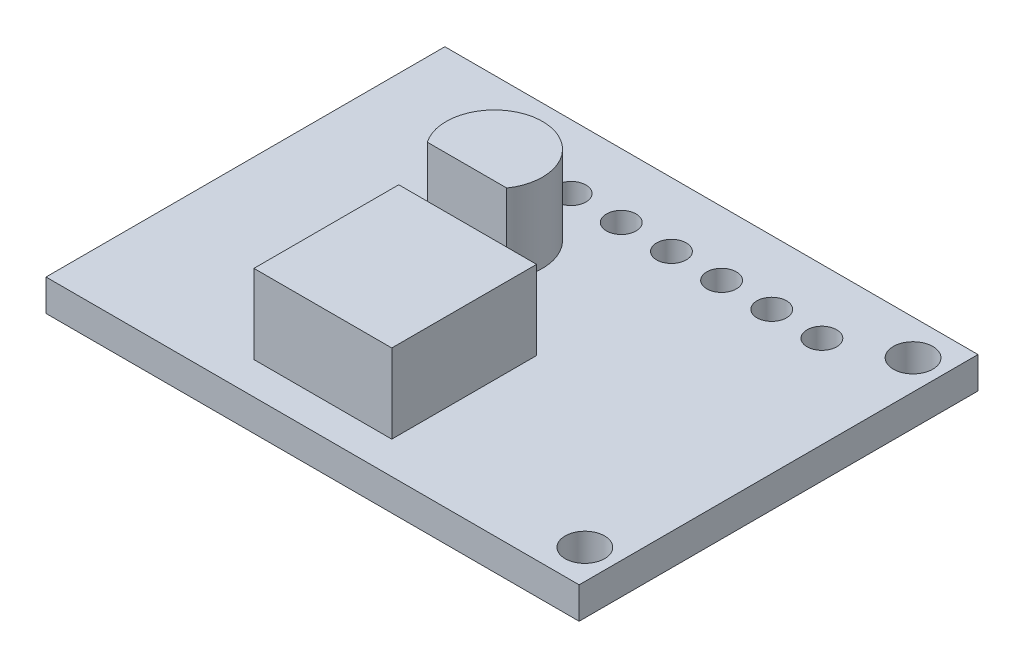
ISO-10303-21;
HEADER;
FILE_DESCRIPTION(('STEP AP214'),'2;1');
FILE_NAME('part.step','',(''),(''),'','','');
FILE_SCHEMA(('AUTOMOTIVE_DESIGN { 1 0 10303 214 1 1 1 1 }'));
ENDSEC;
DATA;
#1=APPLICATION_CONTEXT('core data for automotive mechanical design processes');
#2=APPLICATION_PROTOCOL_DEFINITION('international standard','automotive_design',2000,#1);
#3=PRODUCT_CONTEXT('',#1,'mechanical');
#4=PRODUCT('Part','Part','',(#3));
#5=PRODUCT_RELATED_PRODUCT_CATEGORY('part','',(#4));
#6=PRODUCT_DEFINITION_FORMATION('','',#4);
#7=PRODUCT_DEFINITION_CONTEXT('part definition',#1,'design');
#8=PRODUCT_DEFINITION('design','',#6,#7);
#9=PRODUCT_DEFINITION_SHAPE('','',#8);
#10=(LENGTH_UNIT() NAMED_UNIT(*) SI_UNIT(.MILLI.,.METRE.));
#11=(NAMED_UNIT(*) PLANE_ANGLE_UNIT() SI_UNIT($,.RADIAN.));
#12=(NAMED_UNIT(*) SI_UNIT($,.STERADIAN.) SOLID_ANGLE_UNIT());
#13=UNCERTAINTY_MEASURE_WITH_UNIT(LENGTH_MEASURE(1.E-05),#10,'distance_accuracy_value','');
#14=(GEOMETRIC_REPRESENTATION_CONTEXT(3) GLOBAL_UNCERTAINTY_ASSIGNED_CONTEXT((#13)) GLOBAL_UNIT_ASSIGNED_CONTEXT((#10,
#11,#12)) REPRESENTATION_CONTEXT('',''));
#15=CARTESIAN_POINT('',(0.,0.,0.));
#16=DIRECTION('',(0.,0.,1.));
#17=DIRECTION('',(1.,0.,0.));
#18=AXIS2_PLACEMENT_3D('',#15,#16,#17);
#19=CARTESIAN_POINT('',(0.,1.6,0.));
#20=DIRECTION('',(0.,-1.,0.));
#21=DIRECTION('',(0.,0.,-1.));
#22=AXIS2_PLACEMENT_3D('',#19,#20,#21);
#23=PLANE('',#22);
#24=DIRECTION('',(0.,0.,1.));
#25=VECTOR('',#24,1.);
#26=CARTESIAN_POINT('',(-4.6136955107352,1.6,1.12298160525226));
#27=LINE('',#26,#25);
#28=CARTESIAN_POINT('',(-4.6136955107352,1.6,1.12298160525226));
#29=VERTEX_POINT('',#28);
#30=CARTESIAN_POINT('',(-4.6136955107352,1.6,8.45618678653812));
#31=VERTEX_POINT('',#30);
#32=EDGE_CURVE('E126',#29,#31,#27,.T.);
#33=ORIENTED_EDGE('',*,*,#32,.F.);
#34=DIRECTION('',(-1.,0.,0.));
#35=VECTOR('',#34,1.);
#36=CARTESIAN_POINT('',(-4.6136955107352,1.6,1.12298160525226));
#37=LINE('',#36,#35);
#38=CARTESIAN_POINT('',(2.36773230023067,1.6,1.12298160525226));
#39=VERTEX_POINT('',#38);
#40=EDGE_CURVE('E137',#39,#29,#37,.T.);
#41=ORIENTED_EDGE('',*,*,#40,.F.);
#42=DIRECTION('',(0.,0.,-1.));
#43=VECTOR('',#42,1.);
#44=CARTESIAN_POINT('',(2.36773230023067,1.6,1.12298160525226));
#45=LINE('',#44,#43);
#46=CARTESIAN_POINT('',(2.36773230023067,1.6,8.45618678653812));
#47=VERTEX_POINT('',#46);
#48=EDGE_CURVE('E145',#47,#39,#45,.T.);
#49=ORIENTED_EDGE('',*,*,#48,.F.);
#50=DIRECTION('',(1.,0.,0.));
#51=VECTOR('',#50,1.);
#52=CARTESIAN_POINT('',(-4.6136955107352,1.6,8.45618678653812));
#53=LINE('',#52,#51);
#54=EDGE_CURVE('E55',#31,#47,#53,.T.);
#55=ORIENTED_EDGE('',*,*,#54,.F.);
#56=EDGE_LOOP('',(#33,#41,#49,#55));
#57=FACE_BOUND('',#56,.T.);
#58=CARTESIAN_POINT('',(-3.86497604542497,1.6,-6.85965872123964));
#59=DIRECTION('',(0.,1.,0.));
#60=DIRECTION('',(0.,0.,1.));
#61=AXIS2_PLACEMENT_3D('',#58,#59,#60);
#62=CIRCLE('',#61,0.749999999999999);
#63=CARTESIAN_POINT('',(-3.86497604542497,1.6,-6.10965872123964));
#64=VERTEX_POINT('',#63);
#65=EDGE_CURVE('E160',#64,#64,#62,.T.);
#66=ORIENTED_EDGE('',*,*,#65,.F.);
#67=EDGE_LOOP('',(#66));
#68=FACE_BOUND('',#67,.T.);
#69=CARTESIAN_POINT('',(-1.32497604542497,1.6,-6.85965872123966));
#70=DIRECTION('',(0.,1.,0.));
#71=DIRECTION('',(0.,0.,1.));
#72=AXIS2_PLACEMENT_3D('',#69,#70,#71);
#73=CIRCLE('',#72,0.749999999999999);
#74=CARTESIAN_POINT('',(-1.32497604542497,1.6,-6.10965872123966));
#75=VERTEX_POINT('',#74);
#76=EDGE_CURVE('E164',#75,#75,#73,.T.);
#77=ORIENTED_EDGE('',*,*,#76,.F.);
#78=EDGE_LOOP('',(#77));
#79=FACE_BOUND('',#78,.T.);
#80=CARTESIAN_POINT('',(1.21502395457503,1.6,-6.85965872123967));
#81=DIRECTION('',(0.,1.,0.));
#82=DIRECTION('',(0.,0.,1.));
#83=AXIS2_PLACEMENT_3D('',#80,#81,#82);
#84=CIRCLE('',#83,0.749999999999999);
#85=CARTESIAN_POINT('',(1.21502395457503,1.6,-6.10965872123968));
#86=VERTEX_POINT('',#85);
#87=EDGE_CURVE('E170',#86,#86,#84,.T.);
#88=ORIENTED_EDGE('',*,*,#87,.F.);
#89=EDGE_LOOP('',(#88));
#90=FACE_BOUND('',#89,.T.);
#91=CARTESIAN_POINT('',(3.75502395457503,1.6,-6.85965872123969));
#92=DIRECTION('',(0.,1.,0.));
#93=DIRECTION('',(0.,0.,1.));
#94=AXIS2_PLACEMENT_3D('',#91,#92,#93);
#95=CIRCLE('',#94,0.749999999999999);
#96=CARTESIAN_POINT('',(3.75502395457503,1.6,-6.10965872123969));
#97=VERTEX_POINT('',#96);
#98=EDGE_CURVE('E176',#97,#97,#95,.T.);
#99=ORIENTED_EDGE('',*,*,#98,.F.);
#100=EDGE_LOOP('',(#99));
#101=FACE_BOUND('',#100,.T.);
#102=CARTESIAN_POINT('',(6.29502395457503,1.6,-6.85965872123971));
#103=DIRECTION('',(0.,1.,0.));
#104=DIRECTION('',(0.,0.,1.));
#105=AXIS2_PLACEMENT_3D('',#102,#103,#104);
#106=CIRCLE('',#105,0.749999999999998);
#107=CARTESIAN_POINT('',(6.29502395457503,1.6,-6.10965872123971));
#108=VERTEX_POINT('',#107);
#109=EDGE_CURVE('E182',#108,#108,#106,.T.);
#110=ORIENTED_EDGE('',*,*,#109,.F.);
#111=EDGE_LOOP('',(#110));
#112=FACE_BOUND('',#111,.T.);
#113=CARTESIAN_POINT('',(8.83502395457503,1.6,-6.85965872123973));
#114=DIRECTION('',(0.,1.,0.));
#115=DIRECTION('',(0.,0.,1.));
#116=AXIS2_PLACEMENT_3D('',#113,#114,#115);
#117=CIRCLE('',#116,0.749999999999998);
#118=CARTESIAN_POINT('',(8.83502395457503,1.6,-6.10965872123973));
#119=VERTEX_POINT('',#118);
#120=EDGE_CURVE('E188',#119,#119,#117,.T.);
#121=ORIENTED_EDGE('',*,*,#120,.F.);
#122=EDGE_LOOP('',(#121));
#123=FACE_BOUND('',#122,.T.);
#124=CARTESIAN_POINT('',(12.,1.6,8.31054144281819));
#125=DIRECTION('',(0.,1.,0.));
#126=DIRECTION('',(0.,0.,1.));
#127=AXIS2_PLACEMENT_3D('',#124,#125,#126);
#128=CIRCLE('',#127,1.);
#129=CARTESIAN_POINT('',(12.,1.6,9.31054144281819));
#130=VERTEX_POINT('',#129);
#131=EDGE_CURVE('E194',#130,#130,#128,.T.);
#132=ORIENTED_EDGE('',*,*,#131,.F.);
#133=EDGE_LOOP('',(#132));
#134=FACE_BOUND('',#133,.T.);
#135=CARTESIAN_POINT('',(12.,1.6,-8.31054144281819));
#136=DIRECTION('',(0.,1.,0.));
#137=DIRECTION('',(0.,0.,1.));
#138=AXIS2_PLACEMENT_3D('',#135,#136,#137);
#139=CIRCLE('',#138,1.);
#140=CARTESIAN_POINT('',(12.,1.6,-7.31054144281819));
#141=VERTEX_POINT('',#140);
#142=EDGE_CURVE('E200',#141,#141,#139,.T.);
#143=ORIENTED_EDGE('',*,*,#142,.F.);
#144=EDGE_LOOP('',(#143));
#145=FACE_BOUND('',#144,.T.);
#146=DIRECTION('',(0.,0.,-1.));
#147=VECTOR('',#146,1.);
#148=CARTESIAN_POINT('',(13.5,1.6,10.1));
#149=LINE('',#148,#147);
#150=CARTESIAN_POINT('',(13.5,1.6,10.1));
#151=VERTEX_POINT('',#150);
#152=CARTESIAN_POINT('',(13.5,1.6,-10.1));
#153=VERTEX_POINT('',#152);
#154=EDGE_CURVE('E209',#151,#153,#149,.T.);
#155=ORIENTED_EDGE('',*,*,#154,.T.);
#156=DIRECTION('',(-1.,0.,0.));
#157=VECTOR('',#156,1.);
#158=CARTESIAN_POINT('',(-13.5,1.6,-10.1));
#159=LINE('',#158,#157);
#160=CARTESIAN_POINT('',(-13.5,1.6,-10.1));
#161=VERTEX_POINT('',#160);
#162=EDGE_CURVE('E212',#153,#161,#159,.T.);
#163=ORIENTED_EDGE('',*,*,#162,.T.);
#164=DIRECTION('',(0.,0.,1.));
#165=VECTOR('',#164,1.);
#166=CARTESIAN_POINT('',(-13.5,1.6,10.1));
#167=LINE('',#166,#165);
#168=CARTESIAN_POINT('',(-13.5,1.6,10.1));
#169=VERTEX_POINT('',#168);
#170=EDGE_CURVE('E215',#161,#169,#167,.T.);
#171=ORIENTED_EDGE('',*,*,#170,.T.);
#172=DIRECTION('',(1.,0.,0.));
#173=VECTOR('',#172,1.);
#174=CARTESIAN_POINT('',(-13.5,1.6,10.1));
#175=LINE('',#174,#173);
#176=EDGE_CURVE('E217',#169,#151,#175,.T.);
#177=ORIENTED_EDGE('',*,*,#176,.T.);
#178=EDGE_LOOP('',(#155,#163,#171,#177));
#179=FACE_BOUND('',#178,.T.);
#180=CARTESIAN_POINT('',(-3.74778198379369,1.6,-2.85480865913526));
#181=DIRECTION('',(0.,1.,0.));
#182=DIRECTION('',(0.,0.,1.));
#183=AXIS2_PLACEMENT_3D('',#180,#181,#182);
#184=CIRCLE('',#183,2.44213737419818);
#185=CARTESIAN_POINT('',(-1.73694544412219,1.6,-1.46896185476707));
#186=VERTEX_POINT('',#185);
#187=CARTESIAN_POINT('',(-5.7586185234652,1.6,-1.46896185476707));
#188=VERTEX_POINT('',#187);
#189=EDGE_CURVE('E125',#186,#188,#184,.T.);
#190=ORIENTED_EDGE('',*,*,#189,.F.);
#191=DIRECTION('',(1.,0.,0.));
#192=VECTOR('',#191,1.);
#193=CARTESIAN_POINT('',(-5.7586185234652,1.6,-1.46896185476707));
#194=LINE('',#193,#192);
#195=EDGE_CURVE('E47',#188,#186,#194,.T.);
#196=ORIENTED_EDGE('',*,*,#195,.F.);
#197=EDGE_LOOP('',(#190,#196));
#198=FACE_BOUND('',#197,.T.);
#199=ADVANCED_FACE('F33',(#57,#68,#79,#90,#101,#112,#123,#134,#145,#179,#198),#23,.F.);
#200=CARTESIAN_POINT('',(13.5,1.6,10.1));
#201=DIRECTION('',(-1.,0.,0.));
#202=DIRECTION('',(0.,0.,1.));
#203=AXIS2_PLACEMENT_3D('',#200,#201,#202);
#204=PLANE('',#203);
#205=DIRECTION('',(0.,0.,-1.));
#206=VECTOR('',#205,1.);
#207=CARTESIAN_POINT('',(13.5,0.,10.1));
#208=LINE('',#207,#206);
#209=CARTESIAN_POINT('',(13.5,0.,10.1));
#210=VERTEX_POINT('',#209);
#211=CARTESIAN_POINT('',(13.5,0.,-10.1));
#212=VERTEX_POINT('',#211);
#213=EDGE_CURVE('E206',#210,#212,#208,.T.);
#214=ORIENTED_EDGE('',*,*,#213,.T.);
#215=DIRECTION('',(0.,-1.,0.));
#216=VECTOR('',#215,1.);
#217=CARTESIAN_POINT('',(13.5,1.6,-10.1));
#218=LINE('',#217,#216);
#219=EDGE_CURVE('E11',#153,#212,#218,.T.);
#220=ORIENTED_EDGE('',*,*,#219,.F.);
#221=ORIENTED_EDGE('',*,*,#154,.F.);
#222=DIRECTION('',(0.,-1.,0.));
#223=VECTOR('',#222,1.);
#224=CARTESIAN_POINT('',(13.5,1.6,10.1));
#225=LINE('',#224,#223);
#226=EDGE_CURVE('E219',#151,#210,#225,.T.);
#227=ORIENTED_EDGE('',*,*,#226,.T.);
#228=EDGE_LOOP('',(#214,#220,#221,#227));
#229=FACE_BOUND('',#228,.T.);
#230=ADVANCED_FACE('F35',(#229),#204,.F.);
#231=CARTESIAN_POINT('',(-13.5,1.6,-10.1));
#232=DIRECTION('',(0.,0.,1.));
#233=DIRECTION('',(1.,0.,0.));
#234=AXIS2_PLACEMENT_3D('',#231,#232,#233);
#235=PLANE('',#234);
#236=DIRECTION('',(-1.,0.,0.));
#237=VECTOR('',#236,1.);
#238=CARTESIAN_POINT('',(-13.5,0.,-10.1));
#239=LINE('',#238,#237);
#240=CARTESIAN_POINT('',(-13.5,0.,-10.1));
#241=VERTEX_POINT('',#240);
#242=EDGE_CURVE('E222',#212,#241,#239,.T.);
#243=ORIENTED_EDGE('',*,*,#242,.T.);
#244=DIRECTION('',(0.,-1.,0.));
#245=VECTOR('',#244,1.);
#246=CARTESIAN_POINT('',(-13.5,1.6,-10.1));
#247=LINE('',#246,#245);
#248=EDGE_CURVE('E41',#161,#241,#247,.T.);
#249=ORIENTED_EDGE('',*,*,#248,.F.);
#250=ORIENTED_EDGE('',*,*,#162,.F.);
#251=ORIENTED_EDGE('',*,*,#219,.T.);
#252=EDGE_LOOP('',(#243,#249,#250,#251));
#253=FACE_BOUND('',#252,.T.);
#254=ADVANCED_FACE('F251',(#253),#235,.F.);
#255=CARTESIAN_POINT('',(-13.5,1.6,10.1));
#256=DIRECTION('',(1.,0.,0.));
#257=DIRECTION('',(0.,0.,-1.));
#258=AXIS2_PLACEMENT_3D('',#255,#256,#257);
#259=PLANE('',#258);
#260=DIRECTION('',(0.,0.,1.));
#261=VECTOR('',#260,1.);
#262=CARTESIAN_POINT('',(-13.5,0.,10.1));
#263=LINE('',#262,#261);
#264=CARTESIAN_POINT('',(-13.5,0.,10.1));
#265=VERTEX_POINT('',#264);
#266=EDGE_CURVE('E224',#241,#265,#263,.T.);
#267=ORIENTED_EDGE('',*,*,#266,.T.);
#268=DIRECTION('',(0.,-1.,0.));
#269=VECTOR('',#268,1.);
#270=CARTESIAN_POINT('',(-13.5,1.6,10.1));
#271=LINE('',#270,#269);
#272=EDGE_CURVE('E229',#169,#265,#271,.T.);
#273=ORIENTED_EDGE('',*,*,#272,.F.);
#274=ORIENTED_EDGE('',*,*,#170,.F.);
#275=ORIENTED_EDGE('',*,*,#248,.T.);
#276=EDGE_LOOP('',(#267,#273,#274,#275));
#277=FACE_BOUND('',#276,.T.);
#278=ADVANCED_FACE('F236',(#277),#259,.F.);
#279=CARTESIAN_POINT('',(-13.5,1.6,10.1));
#280=DIRECTION('',(0.,0.,-1.));
#281=DIRECTION('',(-1.,0.,0.));
#282=AXIS2_PLACEMENT_3D('',#279,#280,#281);
#283=PLANE('',#282);
#284=DIRECTION('',(1.,0.,0.));
#285=VECTOR('',#284,1.);
#286=CARTESIAN_POINT('',(-13.5,0.,10.1));
#287=LINE('',#286,#285);
#288=EDGE_CURVE('E213',#265,#210,#287,.T.);
#289=ORIENTED_EDGE('',*,*,#288,.T.);
#290=ORIENTED_EDGE('',*,*,#226,.F.);
#291=ORIENTED_EDGE('',*,*,#176,.F.);
#292=ORIENTED_EDGE('',*,*,#272,.T.);
#293=EDGE_LOOP('',(#289,#290,#291,#292));
#294=FACE_BOUND('',#293,.T.);
#295=ADVANCED_FACE('F245',(#294),#283,.F.);
#296=CARTESIAN_POINT('',(0.,0.,0.));
#297=DIRECTION('',(0.,-1.,0.));
#298=DIRECTION('',(0.,0.,-1.));
#299=AXIS2_PLACEMENT_3D('',#296,#297,#298);
#300=PLANE('',#299);
#301=CARTESIAN_POINT('',(-3.86497604542497,0.,-6.85965872123964));
#302=DIRECTION('',(0.,1.,0.));
#303=DIRECTION('',(0.,0.,1.));
#304=AXIS2_PLACEMENT_3D('',#301,#302,#303);
#305=CIRCLE('',#304,0.749999999999999);
#306=CARTESIAN_POINT('',(-3.86497604542497,0.,-6.10965872123964));
#307=VERTEX_POINT('',#306);
#308=EDGE_CURVE('E161',#307,#307,#305,.T.);
#309=ORIENTED_EDGE('',*,*,#308,.T.);
#310=EDGE_LOOP('',(#309));
#311=FACE_BOUND('',#310,.T.);
#312=CARTESIAN_POINT('',(-1.32497604542497,0.,-6.85965872123966));
#313=DIRECTION('',(0.,1.,0.));
#314=DIRECTION('',(0.,0.,1.));
#315=AXIS2_PLACEMENT_3D('',#312,#313,#314);
#316=CIRCLE('',#315,0.749999999999999);
#317=CARTESIAN_POINT('',(-1.32497604542497,0.,-6.10965872123966));
#318=VERTEX_POINT('',#317);
#319=EDGE_CURVE('E167',#318,#318,#316,.T.);
#320=ORIENTED_EDGE('',*,*,#319,.T.);
#321=EDGE_LOOP('',(#320));
#322=FACE_BOUND('',#321,.T.);
#323=CARTESIAN_POINT('',(1.21502395457503,0.,-6.85965872123967));
#324=DIRECTION('',(0.,1.,0.));
#325=DIRECTION('',(0.,0.,1.));
#326=AXIS2_PLACEMENT_3D('',#323,#324,#325);
#327=CIRCLE('',#326,0.749999999999999);
#328=CARTESIAN_POINT('',(1.21502395457503,0.,-6.10965872123968));
#329=VERTEX_POINT('',#328);
#330=EDGE_CURVE('E173',#329,#329,#327,.T.);
#331=ORIENTED_EDGE('',*,*,#330,.T.);
#332=EDGE_LOOP('',(#331));
#333=FACE_BOUND('',#332,.T.);
#334=CARTESIAN_POINT('',(3.75502395457503,0.,-6.85965872123969));
#335=DIRECTION('',(0.,1.,0.));
#336=DIRECTION('',(0.,0.,1.));
#337=AXIS2_PLACEMENT_3D('',#334,#335,#336);
#338=CIRCLE('',#337,0.749999999999999);
#339=CARTESIAN_POINT('',(3.75502395457503,0.,-6.10965872123969));
#340=VERTEX_POINT('',#339);
#341=EDGE_CURVE('E179',#340,#340,#338,.T.);
#342=ORIENTED_EDGE('',*,*,#341,.T.);
#343=EDGE_LOOP('',(#342));
#344=FACE_BOUND('',#343,.T.);
#345=CARTESIAN_POINT('',(6.29502395457503,0.,-6.85965872123971));
#346=DIRECTION('',(0.,1.,0.));
#347=DIRECTION('',(0.,0.,1.));
#348=AXIS2_PLACEMENT_3D('',#345,#346,#347);
#349=CIRCLE('',#348,0.749999999999998);
#350=CARTESIAN_POINT('',(6.29502395457503,0.,-6.10965872123971));
#351=VERTEX_POINT('',#350);
#352=EDGE_CURVE('E185',#351,#351,#349,.T.);
#353=ORIENTED_EDGE('',*,*,#352,.T.);
#354=EDGE_LOOP('',(#353));
#355=FACE_BOUND('',#354,.T.);
#356=CARTESIAN_POINT('',(8.83502395457503,0.,-6.85965872123973));
#357=DIRECTION('',(0.,1.,0.));
#358=DIRECTION('',(0.,0.,1.));
#359=AXIS2_PLACEMENT_3D('',#356,#357,#358);
#360=CIRCLE('',#359,0.749999999999998);
#361=CARTESIAN_POINT('',(8.83502395457503,0.,-6.10965872123973));
#362=VERTEX_POINT('',#361);
#363=EDGE_CURVE('E191',#362,#362,#360,.T.);
#364=ORIENTED_EDGE('',*,*,#363,.T.);
#365=EDGE_LOOP('',(#364));
#366=FACE_BOUND('',#365,.T.);
#367=CARTESIAN_POINT('',(12.,0.,8.31054144281819));
#368=DIRECTION('',(0.,1.,0.));
#369=DIRECTION('',(0.,0.,1.));
#370=AXIS2_PLACEMENT_3D('',#367,#368,#369);
#371=CIRCLE('',#370,1.);
#372=CARTESIAN_POINT('',(12.,0.,9.31054144281819));
#373=VERTEX_POINT('',#372);
#374=EDGE_CURVE('E197',#373,#373,#371,.T.);
#375=ORIENTED_EDGE('',*,*,#374,.T.);
#376=EDGE_LOOP('',(#375));
#377=FACE_BOUND('',#376,.T.);
#378=CARTESIAN_POINT('',(12.,0.,-8.31054144281819));
#379=DIRECTION('',(0.,1.,0.));
#380=DIRECTION('',(0.,0.,1.));
#381=AXIS2_PLACEMENT_3D('',#378,#379,#380);
#382=CIRCLE('',#381,1.);
#383=CARTESIAN_POINT('',(12.,0.,-7.31054144281819));
#384=VERTEX_POINT('',#383);
#385=EDGE_CURVE('E203',#384,#384,#382,.T.);
#386=ORIENTED_EDGE('',*,*,#385,.T.);
#387=EDGE_LOOP('',(#386));
#388=FACE_BOUND('',#387,.T.);
#389=ORIENTED_EDGE('',*,*,#213,.F.);
#390=ORIENTED_EDGE('',*,*,#288,.F.);
#391=ORIENTED_EDGE('',*,*,#266,.F.);
#392=ORIENTED_EDGE('',*,*,#242,.F.);
#393=EDGE_LOOP('',(#389,#390,#391,#392));
#394=FACE_BOUND('',#393,.T.);
#395=ADVANCED_FACE('F242',(#311,#322,#333,#344,#355,#366,#377,#388,#394),#300,.T.);
#396=CARTESIAN_POINT('',(12.,0.,-8.31054144281819));
#397=DIRECTION('',(0.,1.,0.));
#398=DIRECTION('',(0.,0.,1.));
#399=AXIS2_PLACEMENT_3D('',#396,#397,#398);
#400=CYLINDRICAL_SURFACE('',#399,1.);
#401=ORIENTED_EDGE('',*,*,#385,.F.);
#402=EDGE_LOOP('',(#401));
#403=FACE_BOUND('',#402,.T.);
#404=ORIENTED_EDGE('',*,*,#142,.T.);
#405=EDGE_LOOP('',(#404));
#406=FACE_BOUND('',#405,.T.);
#407=ADVANCED_FACE('F267',(#403,#406),#400,.F.);
#408=CARTESIAN_POINT('',(12.,0.,8.31054144281819));
#409=DIRECTION('',(0.,1.,0.));
#410=DIRECTION('',(0.,0.,1.));
#411=AXIS2_PLACEMENT_3D('',#408,#409,#410);
#412=CYLINDRICAL_SURFACE('',#411,1.);
#413=ORIENTED_EDGE('',*,*,#374,.F.);
#414=EDGE_LOOP('',(#413));
#415=FACE_BOUND('',#414,.T.);
#416=ORIENTED_EDGE('',*,*,#131,.T.);
#417=EDGE_LOOP('',(#416));
#418=FACE_BOUND('',#417,.T.);
#419=ADVANCED_FACE('F292',(#415,#418),#412,.F.);
#420=CARTESIAN_POINT('',(8.83502395457503,0.,-6.85965872123973));
#421=DIRECTION('',(0.,1.,0.));
#422=DIRECTION('',(0.,0.,1.));
#423=AXIS2_PLACEMENT_3D('',#420,#421,#422);
#424=CYLINDRICAL_SURFACE('',#423,0.749999999999998);
#425=ORIENTED_EDGE('',*,*,#363,.F.);
#426=EDGE_LOOP('',(#425));
#427=FACE_BOUND('',#426,.T.);
#428=ORIENTED_EDGE('',*,*,#120,.T.);
#429=EDGE_LOOP('',(#428));
#430=FACE_BOUND('',#429,.T.);
#431=ADVANCED_FACE('F296',(#427,#430),#424,.F.);
#432=CARTESIAN_POINT('',(6.29502395457503,0.,-6.85965872123971));
#433=DIRECTION('',(0.,1.,0.));
#434=DIRECTION('',(0.,0.,1.));
#435=AXIS2_PLACEMENT_3D('',#432,#433,#434);
#436=CYLINDRICAL_SURFACE('',#435,0.749999999999998);
#437=ORIENTED_EDGE('',*,*,#352,.F.);
#438=EDGE_LOOP('',(#437));
#439=FACE_BOUND('',#438,.T.);
#440=ORIENTED_EDGE('',*,*,#109,.T.);
#441=EDGE_LOOP('',(#440));
#442=FACE_BOUND('',#441,.T.);
#443=ADVANCED_FACE('F309',(#439,#442),#436,.F.);
#444=CARTESIAN_POINT('',(3.75502395457503,0.,-6.85965872123969));
#445=DIRECTION('',(0.,1.,0.));
#446=DIRECTION('',(0.,0.,1.));
#447=AXIS2_PLACEMENT_3D('',#444,#445,#446);
#448=CYLINDRICAL_SURFACE('',#447,0.749999999999999);
#449=ORIENTED_EDGE('',*,*,#341,.F.);
#450=EDGE_LOOP('',(#449));
#451=FACE_BOUND('',#450,.T.);
#452=ORIENTED_EDGE('',*,*,#98,.T.);
#453=EDGE_LOOP('',(#452));
#454=FACE_BOUND('',#453,.T.);
#455=ADVANCED_FACE('F317',(#451,#454),#448,.F.);
#456=CARTESIAN_POINT('',(1.21502395457503,0.,-6.85965872123967));
#457=DIRECTION('',(0.,1.,0.));
#458=DIRECTION('',(0.,0.,1.));
#459=AXIS2_PLACEMENT_3D('',#456,#457,#458);
#460=CYLINDRICAL_SURFACE('',#459,0.749999999999999);
#461=ORIENTED_EDGE('',*,*,#330,.F.);
#462=EDGE_LOOP('',(#461));
#463=FACE_BOUND('',#462,.T.);
#464=ORIENTED_EDGE('',*,*,#87,.T.);
#465=EDGE_LOOP('',(#464));
#466=FACE_BOUND('',#465,.T.);
#467=ADVANCED_FACE('F325',(#463,#466),#460,.F.);
#468=CARTESIAN_POINT('',(-1.32497604542497,0.,-6.85965872123966));
#469=DIRECTION('',(0.,1.,0.));
#470=DIRECTION('',(0.,0.,1.));
#471=AXIS2_PLACEMENT_3D('',#468,#469,#470);
#472=CYLINDRICAL_SURFACE('',#471,0.749999999999999);
#473=ORIENTED_EDGE('',*,*,#319,.F.);
#474=EDGE_LOOP('',(#473));
#475=FACE_BOUND('',#474,.T.);
#476=ORIENTED_EDGE('',*,*,#76,.T.);
#477=EDGE_LOOP('',(#476));
#478=FACE_BOUND('',#477,.T.);
#479=ADVANCED_FACE('F333',(#475,#478),#472,.F.);
#480=CARTESIAN_POINT('',(-3.86497604542497,0.,-6.85965872123964));
#481=DIRECTION('',(0.,1.,0.));
#482=DIRECTION('',(0.,0.,1.));
#483=AXIS2_PLACEMENT_3D('',#480,#481,#482);
#484=CYLINDRICAL_SURFACE('',#483,0.749999999999999);
#485=ORIENTED_EDGE('',*,*,#308,.F.);
#486=EDGE_LOOP('',(#485));
#487=FACE_BOUND('',#486,.T.);
#488=ORIENTED_EDGE('',*,*,#65,.T.);
#489=EDGE_LOOP('',(#488));
#490=FACE_BOUND('',#489,.T.);
#491=ADVANCED_FACE('F341',(#487,#490),#484,.F.);
#492=CARTESIAN_POINT('',(-4.6136955107352,5.6,1.12298160525226));
#493=DIRECTION('',(1.,0.,0.));
#494=DIRECTION('',(0.,0.,-1.));
#495=AXIS2_PLACEMENT_3D('',#492,#493,#494);
#496=PLANE('',#495);
#497=ORIENTED_EDGE('',*,*,#32,.T.);
#498=DIRECTION('',(0.,-1.,0.));
#499=VECTOR('',#498,1.);
#500=CARTESIAN_POINT('',(-4.6136955107352,5.6,8.45618678653812));
#501=LINE('',#500,#499);
#502=CARTESIAN_POINT('',(-4.6136955107352,5.6,8.45618678653812));
#503=VERTEX_POINT('',#502);
#504=EDGE_CURVE('E158',#503,#31,#501,.T.);
#505=ORIENTED_EDGE('',*,*,#504,.F.);
#506=DIRECTION('',(0.,0.,1.));
#507=VECTOR('',#506,1.);
#508=CARTESIAN_POINT('',(-4.6136955107352,5.6,1.12298160525226));
#509=LINE('',#508,#507);
#510=CARTESIAN_POINT('',(-4.6136955107352,5.6,1.12298160525226));
#511=VERTEX_POINT('',#510);
#512=EDGE_CURVE('E133',#511,#503,#509,.T.);
#513=ORIENTED_EDGE('',*,*,#512,.F.);
#514=DIRECTION('',(0.,-1.,0.));
#515=VECTOR('',#514,1.);
#516=CARTESIAN_POINT('',(-4.6136955107352,5.6,1.12298160525226));
#517=LINE('',#516,#515);
#518=EDGE_CURVE('E142',#511,#29,#517,.T.);
#519=ORIENTED_EDGE('',*,*,#518,.T.);
#520=EDGE_LOOP('',(#497,#505,#513,#519));
#521=FACE_BOUND('',#520,.T.);
#522=ADVANCED_FACE('F349',(#521),#496,.F.);
#523=CARTESIAN_POINT('',(-4.6136955107352,5.6,8.45618678653812));
#524=DIRECTION('',(0.,0.,-1.));
#525=DIRECTION('',(-1.,0.,0.));
#526=AXIS2_PLACEMENT_3D('',#523,#524,#525);
#527=PLANE('',#526);
#528=ORIENTED_EDGE('',*,*,#54,.T.);
#529=DIRECTION('',(0.,-1.,0.));
#530=VECTOR('',#529,1.);
#531=CARTESIAN_POINT('',(2.36773230023067,5.6,8.45618678653812));
#532=LINE('',#531,#530);
#533=CARTESIAN_POINT('',(2.36773230023067,5.6,8.45618678653812));
#534=VERTEX_POINT('',#533);
#535=EDGE_CURVE('E155',#534,#47,#532,.T.);
#536=ORIENTED_EDGE('',*,*,#535,.F.);
#537=DIRECTION('',(1.,0.,0.));
#538=VECTOR('',#537,1.);
#539=CARTESIAN_POINT('',(-4.6136955107352,5.6,8.45618678653812));
#540=LINE('',#539,#538);
#541=EDGE_CURVE('E136',#503,#534,#540,.T.);
#542=ORIENTED_EDGE('',*,*,#541,.F.);
#543=ORIENTED_EDGE('',*,*,#504,.T.);
#544=EDGE_LOOP('',(#528,#536,#542,#543));
#545=FACE_BOUND('',#544,.T.);
#546=ADVANCED_FACE('F357',(#545),#527,.F.);
#547=CARTESIAN_POINT('',(2.36773230023067,5.6,1.12298160525226));
#548=DIRECTION('',(-1.,0.,0.));
#549=DIRECTION('',(0.,0.,1.));
#550=AXIS2_PLACEMENT_3D('',#547,#548,#549);
#551=PLANE('',#550);
#552=ORIENTED_EDGE('',*,*,#48,.T.);
#553=DIRECTION('',(0.,-1.,0.));
#554=VECTOR('',#553,1.);
#555=CARTESIAN_POINT('',(2.36773230023067,5.6,1.12298160525226));
#556=LINE('',#555,#554);
#557=CARTESIAN_POINT('',(2.36773230023067,5.6,1.12298160525226));
#558=VERTEX_POINT('',#557);
#559=EDGE_CURVE('E152',#558,#39,#556,.T.);
#560=ORIENTED_EDGE('',*,*,#559,.F.);
#561=DIRECTION('',(0.,0.,-1.));
#562=VECTOR('',#561,1.);
#563=CARTESIAN_POINT('',(2.36773230023067,5.6,1.12298160525226));
#564=LINE('',#563,#562);
#565=EDGE_CURVE('E139',#534,#558,#564,.T.);
#566=ORIENTED_EDGE('',*,*,#565,.F.);
#567=ORIENTED_EDGE('',*,*,#535,.T.);
#568=EDGE_LOOP('',(#552,#560,#566,#567));
#569=FACE_BOUND('',#568,.T.);
#570=ADVANCED_FACE('F365',(#569),#551,.F.);
#571=CARTESIAN_POINT('',(-4.6136955107352,5.6,1.12298160525226));
#572=DIRECTION('',(0.,0.,1.));
#573=DIRECTION('',(1.,0.,0.));
#574=AXIS2_PLACEMENT_3D('',#571,#572,#573);
#575=PLANE('',#574);
#576=ORIENTED_EDGE('',*,*,#40,.T.);
#577=ORIENTED_EDGE('',*,*,#518,.F.);
#578=DIRECTION('',(-1.,0.,0.));
#579=VECTOR('',#578,1.);
#580=CARTESIAN_POINT('',(-4.6136955107352,5.6,1.12298160525226));
#581=LINE('',#580,#579);
#582=EDGE_CURVE('E141',#558,#511,#581,.T.);
#583=ORIENTED_EDGE('',*,*,#582,.F.);
#584=ORIENTED_EDGE('',*,*,#559,.T.);
#585=EDGE_LOOP('',(#576,#577,#583,#584));
#586=FACE_BOUND('',#585,.T.);
#587=ADVANCED_FACE('F373',(#586),#575,.F.);
#588=CARTESIAN_POINT('',(0.,5.6,0.));
#589=DIRECTION('',(0.,1.,0.));
#590=DIRECTION('',(0.,0.,1.));
#591=AXIS2_PLACEMENT_3D('',#588,#589,#590);
#592=PLANE('',#591);
#593=ORIENTED_EDGE('',*,*,#512,.T.);
#594=ORIENTED_EDGE('',*,*,#541,.T.);
#595=ORIENTED_EDGE('',*,*,#565,.T.);
#596=ORIENTED_EDGE('',*,*,#582,.T.);
#597=EDGE_LOOP('',(#593,#594,#595,#596));
#598=FACE_BOUND('',#597,.T.);
#599=ADVANCED_FACE('F381',(#598),#592,.T.);
#600=CARTESIAN_POINT('',(-3.74778198379369,5.6,-2.85480865913526));
#601=DIRECTION('',(0.,-1.,0.));
#602=DIRECTION('',(0.,0.,-1.));
#603=AXIS2_PLACEMENT_3D('',#600,#601,#602);
#604=CYLINDRICAL_SURFACE('',#603,2.44213737419818);
#605=ORIENTED_EDGE('',*,*,#189,.T.);
#606=DIRECTION('',(0.,-1.,0.));
#607=VECTOR('',#606,1.);
#608=CARTESIAN_POINT('',(-5.7586185234652,5.6,-1.46896185476707));
#609=LINE('',#608,#607);
#610=CARTESIAN_POINT('',(-5.7586185234652,5.6,-1.46896185476707));
#611=VERTEX_POINT('',#610);
#612=EDGE_CURVE('E113',#611,#188,#609,.T.);
#613=ORIENTED_EDGE('',*,*,#612,.F.);
#614=CARTESIAN_POINT('',(-3.74778198379369,5.6,-2.85480865913526));
#615=DIRECTION('',(0.,1.,0.));
#616=DIRECTION('',(0.,0.,1.));
#617=AXIS2_PLACEMENT_3D('',#614,#615,#616);
#618=CIRCLE('',#617,2.44213737419818);
#619=CARTESIAN_POINT('',(-1.73694544412219,5.6,-1.46896185476707));
#620=VERTEX_POINT('',#619);
#621=EDGE_CURVE('E119',#620,#611,#618,.T.);
#622=ORIENTED_EDGE('',*,*,#621,.F.);
#623=DIRECTION('',(0.,-1.,0.));
#624=VECTOR('',#623,1.);
#625=CARTESIAN_POINT('',(-1.73694544412219,5.6,-1.46896185476707));
#626=LINE('',#625,#624);
#627=EDGE_CURVE('E116',#620,#186,#626,.T.);
#628=ORIENTED_EDGE('',*,*,#627,.T.);
#629=EDGE_LOOP('',(#605,#613,#622,#628));
#630=FACE_BOUND('',#629,.T.);
#631=ADVANCED_FACE('F124',(#630),#604,.T.);
#632=CARTESIAN_POINT('',(-5.7586185234652,5.6,-1.46896185476707));
#633=DIRECTION('',(0.,0.,-1.));
#634=DIRECTION('',(-1.,0.,0.));
#635=AXIS2_PLACEMENT_3D('',#632,#633,#634);
#636=PLANE('',#635);
#637=ORIENTED_EDGE('',*,*,#195,.T.);
#638=ORIENTED_EDGE('',*,*,#627,.F.);
#639=DIRECTION('',(1.,0.,0.));
#640=VECTOR('',#639,1.);
#641=CARTESIAN_POINT('',(-5.7586185234652,5.6,-1.46896185476707));
#642=LINE('',#641,#640);
#643=EDGE_CURVE('E109',#611,#620,#642,.T.);
#644=ORIENTED_EDGE('',*,*,#643,.F.);
#645=ORIENTED_EDGE('',*,*,#612,.T.);
#646=EDGE_LOOP('',(#637,#638,#644,#645));
#647=FACE_BOUND('',#646,.T.);
#648=ADVANCED_FACE('F111',(#647),#636,.F.);
#649=CARTESIAN_POINT('',(-3.74778198379369,5.6,-2.85480865913526));
#650=DIRECTION('',(0.,1.,0.));
#651=DIRECTION('',(0.,0.,1.));
#652=AXIS2_PLACEMENT_3D('',#649,#650,#651);
#653=PLANE('',#652);
#654=ORIENTED_EDGE('',*,*,#621,.T.);
#655=ORIENTED_EDGE('',*,*,#643,.T.);
#656=EDGE_LOOP('',(#654,#655));
#657=FACE_BOUND('',#656,.T.);
#658=ADVANCED_FACE('F121',(#657),#653,.T.);
#659=CLOSED_SHELL('',(#199,#230,#254,#278,#295,#395,#407,#419,#431,#443,#455,#467,#479,#491,
#522,#546,#570,#587,#599,#631,#648,#658));
#660=MANIFOLD_SOLID_BREP('B2',#659);
#661=ADVANCED_BREP_SHAPE_REPRESENTATION('',(#18,#660),#14);
#662=SHAPE_DEFINITION_REPRESENTATION(#9,#661);
ENDSEC;
END-ISO-10303-21;
